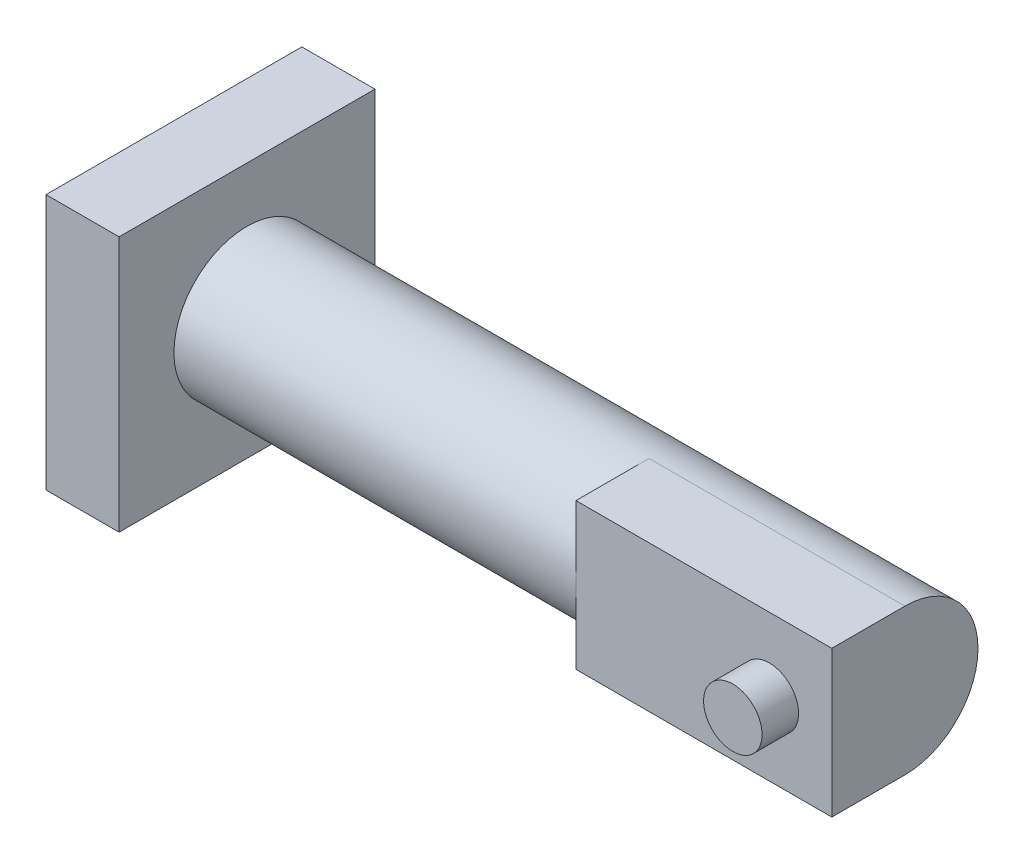
ISO-10303-21;
HEADER;
FILE_DESCRIPTION(('STEP AP214'),'2;1');
FILE_NAME('part.step','',(''),(''),'','','');
FILE_SCHEMA(('AUTOMOTIVE_DESIGN { 1 0 10303 214 1 1 1 1 }'));
ENDSEC;
DATA;
#1=APPLICATION_CONTEXT('core data for automotive mechanical design processes');
#2=APPLICATION_PROTOCOL_DEFINITION('international standard','automotive_design',2000,#1);
#3=PRODUCT_CONTEXT('',#1,'mechanical');
#4=PRODUCT('Part','Part','',(#3));
#5=PRODUCT_RELATED_PRODUCT_CATEGORY('part','',(#4));
#6=PRODUCT_DEFINITION_FORMATION('','',#4);
#7=PRODUCT_DEFINITION_CONTEXT('part definition',#1,'design');
#8=PRODUCT_DEFINITION('design','',#6,#7);
#9=PRODUCT_DEFINITION_SHAPE('','',#8);
#10=(LENGTH_UNIT() NAMED_UNIT(*) SI_UNIT(.MILLI.,.METRE.));
#11=(NAMED_UNIT(*) PLANE_ANGLE_UNIT() SI_UNIT($,.RADIAN.));
#12=(NAMED_UNIT(*) SI_UNIT($,.STERADIAN.) SOLID_ANGLE_UNIT());
#13=UNCERTAINTY_MEASURE_WITH_UNIT(LENGTH_MEASURE(1.E-05),#10,'distance_accuracy_value','');
#14=(GEOMETRIC_REPRESENTATION_CONTEXT(3) GLOBAL_UNCERTAINTY_ASSIGNED_CONTEXT((#13)) GLOBAL_UNIT_ASSIGNED_CONTEXT((#10,
#11,#12)) REPRESENTATION_CONTEXT('',''));
#15=CARTESIAN_POINT('',(0.,0.,0.));
#16=DIRECTION('',(0.,0.,1.));
#17=DIRECTION('',(1.,0.,0.));
#18=AXIS2_PLACEMENT_3D('',#15,#16,#17);
#19=CARTESIAN_POINT('',(90.,0.,0.));
#20=DIRECTION('',(-1.,0.,0.));
#21=DIRECTION('',(0.,0.,1.));
#22=AXIS2_PLACEMENT_3D('',#19,#20,#21);
#23=CYLINDRICAL_SURFACE('',#22,10.);
#24=CARTESIAN_POINT('',(0.,0.,0.));
#25=DIRECTION('',(1.,0.,0.));
#26=DIRECTION('',(0.,0.,-1.));
#27=AXIS2_PLACEMENT_3D('',#24,#25,#26);
#28=CIRCLE('',#27,10.);
#29=CARTESIAN_POINT('',(0.,0.,-10.));
#30=VERTEX_POINT('',#29);
#31=EDGE_CURVE('E128',#30,#30,#28,.T.);
#32=ORIENTED_EDGE('',*,*,#31,.T.);
#33=EDGE_LOOP('',(#32));
#34=FACE_BOUND('',#33,.T.);
#35=DIRECTION('',(-1.,0.,0.));
#36=VECTOR('',#35,1.);
#37=CARTESIAN_POINT('',(90.,10.,0.));
#38=LINE('',#37,#36);
#39=CARTESIAN_POINT('',(90.,10.,0.));
#40=VERTEX_POINT('',#39);
#41=CARTESIAN_POINT('',(55.,10.,0.));
#42=VERTEX_POINT('',#41);
#43=EDGE_CURVE('E139',#40,#42,#38,.T.);
#44=ORIENTED_EDGE('',*,*,#43,.F.);
#45=CARTESIAN_POINT('',(90.,0.,0.));
#46=DIRECTION('',(1.,0.,0.));
#47=DIRECTION('',(0.,0.,-1.));
#48=AXIS2_PLACEMENT_3D('',#45,#46,#47);
#49=CIRCLE('',#48,10.);
#50=CARTESIAN_POINT('',(90.,-10.,0.));
#51=VERTEX_POINT('',#50);
#52=EDGE_CURVE('E169',#51,#40,#49,.T.);
#53=ORIENTED_EDGE('',*,*,#52,.F.);
#54=DIRECTION('',(1.,0.,0.));
#55=VECTOR('',#54,1.);
#56=CARTESIAN_POINT('',(90.,-10.,0.));
#57=LINE('',#56,#55);
#58=CARTESIAN_POINT('',(55.,-10.,0.));
#59=VERTEX_POINT('',#58);
#60=EDGE_CURVE('E145',#59,#51,#57,.T.);
#61=ORIENTED_EDGE('',*,*,#60,.F.);
#62=CARTESIAN_POINT('',(55.,0.,0.));
#63=DIRECTION('',(1.,0.,0.));
#64=DIRECTION('',(0.,0.,-1.));
#65=AXIS2_PLACEMENT_3D('',#62,#63,#64);
#66=CIRCLE('',#65,10.);
#67=CARTESIAN_POINT('',(55.,0.,10.));
#68=VERTEX_POINT('',#67);
#69=EDGE_CURVE('E44',#68,#59,#66,.T.);
#70=ORIENTED_EDGE('',*,*,#69,.F.);
#71=EDGE_CURVE('E11',#42,#68,#66,.T.);
#72=ORIENTED_EDGE('',*,*,#71,.F.);
#73=EDGE_LOOP('',(#44,#53,#61,#70,#72));
#74=FACE_BOUND('',#73,.T.);
#75=ADVANCED_FACE('F41',(#34,#74),#23,.T.);
#76=CARTESIAN_POINT('',(90.,0.,0.));
#77=DIRECTION('',(1.,0.,0.));
#78=DIRECTION('',(0.,0.,-1.));
#79=AXIS2_PLACEMENT_3D('',#76,#77,#78);
#80=PLANE('',#79);
#81=ORIENTED_EDGE('',*,*,#52,.T.);
#82=DIRECTION('',(0.,0.,-1.));
#83=VECTOR('',#82,1.);
#84=CARTESIAN_POINT('',(90.,10.,10.));
#85=LINE('',#84,#83);
#86=CARTESIAN_POINT('',(90.,10.,10.));
#87=VERTEX_POINT('',#86);
#88=EDGE_CURVE('E166',#87,#40,#85,.T.);
#89=ORIENTED_EDGE('',*,*,#88,.F.);
#90=DIRECTION('',(0.,1.,0.));
#91=VECTOR('',#90,1.);
#92=CARTESIAN_POINT('',(90.,-10.,10.));
#93=LINE('',#92,#91);
#94=CARTESIAN_POINT('',(90.,-10.,10.));
#95=VERTEX_POINT('',#94);
#96=EDGE_CURVE('E142',#95,#87,#93,.T.);
#97=ORIENTED_EDGE('',*,*,#96,.F.);
#98=DIRECTION('',(0.,0.,-1.));
#99=VECTOR('',#98,1.);
#100=CARTESIAN_POINT('',(90.,-10.,10.));
#101=LINE('',#100,#99);
#102=EDGE_CURVE('E154',#95,#51,#101,.T.);
#103=ORIENTED_EDGE('',*,*,#102,.T.);
#104=EDGE_LOOP('',(#81,#89,#97,#103));
#105=FACE_BOUND('',#104,.T.);
#106=ADVANCED_FACE('F191',(#105),#80,.T.);
#107=CARTESIAN_POINT('',(55.,-10.,10.));
#108=DIRECTION('',(1.,0.,0.));
#109=DIRECTION('',(0.,0.,-1.));
#110=AXIS2_PLACEMENT_3D('',#107,#108,#109);
#111=PLANE('',#110);
#112=DIRECTION('',(0.,0.,-1.));
#113=VECTOR('',#112,1.);
#114=CARTESIAN_POINT('',(55.,10.,10.));
#115=LINE('',#114,#113);
#116=CARTESIAN_POINT('',(55.,10.,10.));
#117=VERTEX_POINT('',#116);
#118=EDGE_CURVE('E163',#117,#42,#115,.T.);
#119=ORIENTED_EDGE('',*,*,#118,.T.);
#120=ORIENTED_EDGE('',*,*,#71,.T.);
#121=DIRECTION('',(0.,-1.,0.));
#122=VECTOR('',#121,1.);
#123=CARTESIAN_POINT('',(55.,-10.,10.));
#124=LINE('',#123,#122);
#125=EDGE_CURVE('E148',#117,#68,#124,.T.);
#126=ORIENTED_EDGE('',*,*,#125,.F.);
#127=EDGE_LOOP('',(#119,#120,#126));
#128=FACE_BOUND('',#127,.T.);
#129=ADVANCED_FACE('F187',(#128),#111,.F.);
#130=CARTESIAN_POINT('',(0.,0.,10.));
#131=DIRECTION('',(0.,0.,1.));
#132=DIRECTION('',(1.,0.,0.));
#133=AXIS2_PLACEMENT_3D('',#130,#131,#132);
#134=PLANE('',#133);
#135=CARTESIAN_POINT('',(81.45858647,0.,10.));
#136=DIRECTION('',(0.,0.,1.));
#137=DIRECTION('',(1.,0.,0.));
#138=AXIS2_PLACEMENT_3D('',#135,#136,#137);
#139=CIRCLE('',#138,3.99999999999999);
#140=CARTESIAN_POINT('',(85.45858647,0.,10.));
#141=VERTEX_POINT('',#140);
#142=EDGE_CURVE('E131',#141,#141,#139,.T.);
#143=ORIENTED_EDGE('',*,*,#142,.F.);
#144=EDGE_LOOP('',(#143));
#145=FACE_BOUND('',#144,.T.);
#146=ORIENTED_EDGE('',*,*,#125,.T.);
#147=CARTESIAN_POINT('',(55.,-10.,10.));
#148=VERTEX_POINT('',#147);
#149=EDGE_CURVE('E147',#68,#148,#124,.T.);
#150=ORIENTED_EDGE('',*,*,#149,.T.);
#151=DIRECTION('',(1.,0.,0.));
#152=VECTOR('',#151,1.);
#153=CARTESIAN_POINT('',(90.,-10.,10.));
#154=LINE('',#153,#152);
#155=EDGE_CURVE('E151',#148,#95,#154,.T.);
#156=ORIENTED_EDGE('',*,*,#155,.T.);
#157=ORIENTED_EDGE('',*,*,#96,.T.);
#158=DIRECTION('',(-1.,0.,0.));
#159=VECTOR('',#158,1.);
#160=CARTESIAN_POINT('',(90.,10.,10.));
#161=LINE('',#160,#159);
#162=EDGE_CURVE('E144',#87,#117,#161,.T.);
#163=ORIENTED_EDGE('',*,*,#162,.T.);
#164=EDGE_LOOP('',(#146,#150,#156,#157,#163));
#165=FACE_BOUND('',#164,.T.);
#166=ADVANCED_FACE('F182',(#145,#165),#134,.T.);
#167=CARTESIAN_POINT('',(90.,10.,10.));
#168=DIRECTION('',(0.,-1.,0.));
#169=DIRECTION('',(1.,0.,0.));
#170=AXIS2_PLACEMENT_3D('',#167,#168,#169);
#171=PLANE('',#170);
#172=ORIENTED_EDGE('',*,*,#43,.T.);
#173=ORIENTED_EDGE('',*,*,#118,.F.);
#174=ORIENTED_EDGE('',*,*,#162,.F.);
#175=ORIENTED_EDGE('',*,*,#88,.T.);
#176=EDGE_LOOP('',(#172,#173,#174,#175));
#177=FACE_BOUND('',#176,.T.);
#178=ADVANCED_FACE('F189',(#177),#171,.F.);
#179=ORIENTED_EDGE('',*,*,#149,.F.);
#180=ORIENTED_EDGE('',*,*,#69,.T.);
#181=DIRECTION('',(0.,0.,-1.));
#182=VECTOR('',#181,1.);
#183=CARTESIAN_POINT('',(55.,-10.,10.));
#184=LINE('',#183,#182);
#185=EDGE_CURVE('E160',#148,#59,#184,.T.);
#186=ORIENTED_EDGE('',*,*,#185,.F.);
#187=EDGE_LOOP('',(#179,#180,#186));
#188=FACE_BOUND('',#187,.T.);
#189=ADVANCED_FACE('F176',(#188),#111,.F.);
#190=CARTESIAN_POINT('',(90.,-10.,10.));
#191=DIRECTION('',(0.,1.,0.));
#192=DIRECTION('',(-1.,0.,0.));
#193=AXIS2_PLACEMENT_3D('',#190,#191,#192);
#194=PLANE('',#193);
#195=ORIENTED_EDGE('',*,*,#60,.T.);
#196=ORIENTED_EDGE('',*,*,#102,.F.);
#197=ORIENTED_EDGE('',*,*,#155,.F.);
#198=ORIENTED_EDGE('',*,*,#185,.T.);
#199=EDGE_LOOP('',(#195,#196,#197,#198));
#200=FACE_BOUND('',#199,.T.);
#201=ADVANCED_FACE('F179',(#200),#194,.F.);
#202=CARTESIAN_POINT('',(81.45858647,0.,15.));
#203=DIRECTION('',(0.,0.,-1.));
#204=DIRECTION('',(-1.,0.,0.));
#205=AXIS2_PLACEMENT_3D('',#202,#203,#204);
#206=CYLINDRICAL_SURFACE('',#205,3.99999999999999);
#207=CARTESIAN_POINT('',(81.45858647,0.,15.));
#208=DIRECTION('',(0.,0.,1.));
#209=DIRECTION('',(1.,0.,0.));
#210=AXIS2_PLACEMENT_3D('',#207,#208,#209);
#211=CIRCLE('',#210,3.99999999999999);
#212=CARTESIAN_POINT('',(85.45858647,0.,15.));
#213=VERTEX_POINT('',#212);
#214=EDGE_CURVE('E136',#213,#213,#211,.T.);
#215=ORIENTED_EDGE('',*,*,#214,.F.);
#216=EDGE_LOOP('',(#215));
#217=FACE_BOUND('',#216,.T.);
#218=ORIENTED_EDGE('',*,*,#142,.T.);
#219=EDGE_LOOP('',(#218));
#220=FACE_BOUND('',#219,.T.);
#221=ADVANCED_FACE('F234',(#217,#220),#206,.T.);
#222=CARTESIAN_POINT('',(81.45858647,0.,15.));
#223=DIRECTION('',(0.,0.,1.));
#224=DIRECTION('',(1.,0.,0.));
#225=AXIS2_PLACEMENT_3D('',#222,#223,#224);
#226=PLANE('',#225);
#227=ORIENTED_EDGE('',*,*,#214,.T.);
#228=EDGE_LOOP('',(#227));
#229=FACE_BOUND('',#228,.T.);
#230=ADVANCED_FACE('F231',(#229),#226,.T.);
#231=CARTESIAN_POINT('',(-10.,-17.5,17.5));
#232=DIRECTION('',(0.,0.,-1.));
#233=DIRECTION('',(-1.,0.,0.));
#234=AXIS2_PLACEMENT_3D('',#231,#232,#233);
#235=PLANE('',#234);
#236=DIRECTION('',(0.,1.,0.));
#237=VECTOR('',#236,1.);
#238=CARTESIAN_POINT('',(0.,-17.5,17.5));
#239=LINE('',#238,#237);
#240=CARTESIAN_POINT('',(0.,-17.5,17.5));
#241=VERTEX_POINT('',#240);
#242=CARTESIAN_POINT('',(0.,17.5,17.5));
#243=VERTEX_POINT('',#242);
#244=EDGE_CURVE('E127',#241,#243,#239,.T.);
#245=ORIENTED_EDGE('',*,*,#244,.T.);
#246=DIRECTION('',(1.,0.,0.));
#247=VECTOR('',#246,1.);
#248=CARTESIAN_POINT('',(-10.,17.5,17.5));
#249=LINE('',#248,#247);
#250=CARTESIAN_POINT('',(-10.,17.5,17.5));
#251=VERTEX_POINT('',#250);
#252=EDGE_CURVE('E107',#251,#243,#249,.T.);
#253=ORIENTED_EDGE('',*,*,#252,.F.);
#254=DIRECTION('',(0.,1.,0.));
#255=VECTOR('',#254,1.);
#256=CARTESIAN_POINT('',(-10.,-17.5,17.5));
#257=LINE('',#256,#255);
#258=CARTESIAN_POINT('',(-10.,-17.5,17.5));
#259=VERTEX_POINT('',#258);
#260=EDGE_CURVE('E114',#259,#251,#257,.T.);
#261=ORIENTED_EDGE('',*,*,#260,.F.);
#262=DIRECTION('',(1.,0.,0.));
#263=VECTOR('',#262,1.);
#264=CARTESIAN_POINT('',(-10.,-17.5,17.5));
#265=LINE('',#264,#263);
#266=EDGE_CURVE('E213',#259,#241,#265,.T.);
#267=ORIENTED_EDGE('',*,*,#266,.T.);
#268=EDGE_LOOP('',(#245,#253,#261,#267));
#269=FACE_BOUND('',#268,.T.);
#270=ADVANCED_FACE('F125',(#269),#235,.F.);
#271=CARTESIAN_POINT('',(-10.,17.5,-17.5));
#272=DIRECTION('',(0.,-1.,0.));
#273=DIRECTION('',(0.,0.,-1.));
#274=AXIS2_PLACEMENT_3D('',#271,#272,#273);
#275=PLANE('',#274);
#276=DIRECTION('',(0.,0.,-1.));
#277=VECTOR('',#276,1.);
#278=CARTESIAN_POINT('',(0.,17.5,-17.5));
#279=LINE('',#278,#277);
#280=CARTESIAN_POINT('',(0.,17.5,-17.5));
#281=VERTEX_POINT('',#280);
#282=EDGE_CURVE('E204',#243,#281,#279,.T.);
#283=ORIENTED_EDGE('',*,*,#282,.T.);
#284=DIRECTION('',(1.,0.,0.));
#285=VECTOR('',#284,1.);
#286=CARTESIAN_POINT('',(-10.,17.5,-17.5));
#287=LINE('',#286,#285);
#288=CARTESIAN_POINT('',(-10.,17.5,-17.5));
#289=VERTEX_POINT('',#288);
#290=EDGE_CURVE('E110',#289,#281,#287,.T.);
#291=ORIENTED_EDGE('',*,*,#290,.F.);
#292=DIRECTION('',(0.,0.,-1.));
#293=VECTOR('',#292,1.);
#294=CARTESIAN_POINT('',(-10.,17.5,-17.5));
#295=LINE('',#294,#293);
#296=EDGE_CURVE('E103',#251,#289,#295,.T.);
#297=ORIENTED_EDGE('',*,*,#296,.F.);
#298=ORIENTED_EDGE('',*,*,#252,.T.);
#299=EDGE_LOOP('',(#283,#291,#297,#298));
#300=FACE_BOUND('',#299,.T.);
#301=ADVANCED_FACE('F105',(#300),#275,.F.);
#302=CARTESIAN_POINT('',(-10.,-17.5,-17.5));
#303=DIRECTION('',(0.,0.,1.));
#304=DIRECTION('',(1.,0.,0.));
#305=AXIS2_PLACEMENT_3D('',#302,#303,#304);
#306=PLANE('',#305);
#307=DIRECTION('',(0.,-1.,0.));
#308=VECTOR('',#307,1.);
#309=CARTESIAN_POINT('',(0.,-17.5,-17.5));
#310=LINE('',#309,#308);
#311=CARTESIAN_POINT('',(0.,-17.5,-17.5));
#312=VERTEX_POINT('',#311);
#313=EDGE_CURVE('E206',#281,#312,#310,.T.);
#314=ORIENTED_EDGE('',*,*,#313,.T.);
#315=DIRECTION('',(1.,0.,0.));
#316=VECTOR('',#315,1.);
#317=CARTESIAN_POINT('',(-10.,-17.5,-17.5));
#318=LINE('',#317,#316);
#319=CARTESIAN_POINT('',(-10.,-17.5,-17.5));
#320=VERTEX_POINT('',#319);
#321=EDGE_CURVE('E132',#320,#312,#318,.T.);
#322=ORIENTED_EDGE('',*,*,#321,.F.);
#323=DIRECTION('',(0.,-1.,0.));
#324=VECTOR('',#323,1.);
#325=CARTESIAN_POINT('',(-10.,-17.5,-17.5));
#326=LINE('',#325,#324);
#327=EDGE_CURVE('E113',#289,#320,#326,.T.);
#328=ORIENTED_EDGE('',*,*,#327,.F.);
#329=ORIENTED_EDGE('',*,*,#290,.T.);
#330=EDGE_LOOP('',(#314,#322,#328,#329));
#331=FACE_BOUND('',#330,.T.);
#332=ADVANCED_FACE('F219',(#331),#306,.F.);
#333=CARTESIAN_POINT('',(-10.,-17.5,-17.5));
#334=DIRECTION('',(0.,1.,0.));
#335=DIRECTION('',(0.,0.,1.));
#336=AXIS2_PLACEMENT_3D('',#333,#334,#335);
#337=PLANE('',#336);
#338=DIRECTION('',(0.,0.,1.));
#339=VECTOR('',#338,1.);
#340=CARTESIAN_POINT('',(0.,-17.5,-17.5));
#341=LINE('',#340,#339);
#342=EDGE_CURVE('E123',#312,#241,#341,.T.);
#343=ORIENTED_EDGE('',*,*,#342,.T.);
#344=ORIENTED_EDGE('',*,*,#266,.F.);
#345=DIRECTION('',(0.,0.,1.));
#346=VECTOR('',#345,1.);
#347=CARTESIAN_POINT('',(-10.,-17.5,-17.5));
#348=LINE('',#347,#346);
#349=EDGE_CURVE('E119',#320,#259,#348,.T.);
#350=ORIENTED_EDGE('',*,*,#349,.F.);
#351=ORIENTED_EDGE('',*,*,#321,.T.);
#352=EDGE_LOOP('',(#343,#344,#350,#351));
#353=FACE_BOUND('',#352,.T.);
#354=ADVANCED_FACE('F217',(#353),#337,.F.);
#355=CARTESIAN_POINT('',(-10.,0.,0.));
#356=DIRECTION('',(1.,0.,0.));
#357=DIRECTION('',(0.,0.,-1.));
#358=AXIS2_PLACEMENT_3D('',#355,#356,#357);
#359=PLANE('',#358);
#360=ORIENTED_EDGE('',*,*,#260,.T.);
#361=ORIENTED_EDGE('',*,*,#296,.T.);
#362=ORIENTED_EDGE('',*,*,#327,.T.);
#363=ORIENTED_EDGE('',*,*,#349,.T.);
#364=EDGE_LOOP('',(#360,#361,#362,#363));
#365=FACE_BOUND('',#364,.T.);
#366=ADVANCED_FACE('F117',(#365),#359,.F.);
#367=CARTESIAN_POINT('',(0.,0.,0.));
#368=DIRECTION('',(1.,0.,0.));
#369=DIRECTION('',(0.,0.,-1.));
#370=AXIS2_PLACEMENT_3D('',#367,#368,#369);
#371=PLANE('',#370);
#372=ORIENTED_EDGE('',*,*,#31,.F.);
#373=EDGE_LOOP('',(#372));
#374=FACE_BOUND('',#373,.T.);
#375=ORIENTED_EDGE('',*,*,#244,.F.);
#376=ORIENTED_EDGE('',*,*,#342,.F.);
#377=ORIENTED_EDGE('',*,*,#313,.F.);
#378=ORIENTED_EDGE('',*,*,#282,.F.);
#379=EDGE_LOOP('',(#375,#376,#377,#378));
#380=FACE_BOUND('',#379,.T.);
#381=ADVANCED_FACE('F198',(#374,#380),#371,.T.);
#382=CLOSED_SHELL('',(#75,#106,#129,#166,#178,#189,#201,#221,#230,#270,#301,#332,#354,#366,#381));
#383=MANIFOLD_SOLID_BREP('B2',#382);
#384=ADVANCED_BREP_SHAPE_REPRESENTATION('',(#18,#383),#14);
#385=SHAPE_DEFINITION_REPRESENTATION(#9,#384);
ENDSEC;
END-ISO-10303-21;
